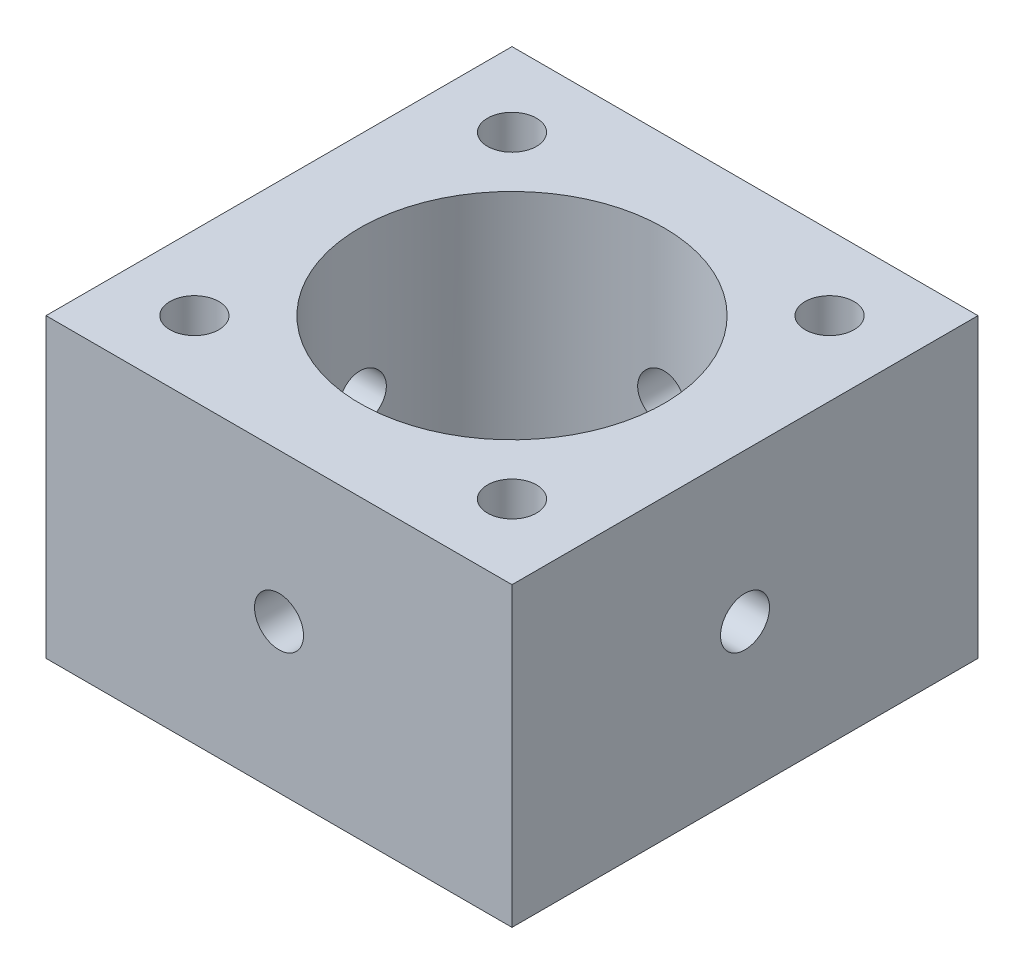
ISO-10303-21;
HEADER;
FILE_DESCRIPTION(('STEP AP214'),'2;1');
FILE_NAME('part.step','',(''),(''),'','','');
FILE_SCHEMA(('AUTOMOTIVE_DESIGN { 1 0 10303 214 1 1 1 1 }'));
ENDSEC;
DATA;
#1=APPLICATION_CONTEXT('core data for automotive mechanical design processes');
#2=APPLICATION_PROTOCOL_DEFINITION('international standard','automotive_design',2000,#1);
#3=PRODUCT_CONTEXT('',#1,'mechanical');
#4=PRODUCT('Part','Part','',(#3));
#5=PRODUCT_RELATED_PRODUCT_CATEGORY('part','',(#4));
#6=PRODUCT_DEFINITION_FORMATION('','',#4);
#7=PRODUCT_DEFINITION_CONTEXT('part definition',#1,'design');
#8=PRODUCT_DEFINITION('design','',#6,#7);
#9=PRODUCT_DEFINITION_SHAPE('','',#8);
#10=(LENGTH_UNIT() NAMED_UNIT(*) SI_UNIT(.MILLI.,.METRE.));
#11=(NAMED_UNIT(*) PLANE_ANGLE_UNIT() SI_UNIT($,.RADIAN.));
#12=(NAMED_UNIT(*) SI_UNIT($,.STERADIAN.) SOLID_ANGLE_UNIT());
#13=UNCERTAINTY_MEASURE_WITH_UNIT(LENGTH_MEASURE(1.E-05),#10,'distance_accuracy_value','');
#14=(GEOMETRIC_REPRESENTATION_CONTEXT(3) GLOBAL_UNCERTAINTY_ASSIGNED_CONTEXT((#13)) GLOBAL_UNIT_ASSIGNED_CONTEXT((#10,
#11,#12)) REPRESENTATION_CONTEXT('',''));
#15=CARTESIAN_POINT('',(0.,0.,0.));
#16=DIRECTION('',(0.,0.,1.));
#17=DIRECTION('',(1.,0.,0.));
#18=AXIS2_PLACEMENT_3D('',#15,#16,#17);
#19=CARTESIAN_POINT('',(-15.7,0.,15.7));
#20=DIRECTION('',(0.,1.,0.));
#21=DIRECTION('',(0.,0.,1.));
#22=AXIS2_PLACEMENT_3D('',#19,#20,#21);
#23=PLANE('',#22);
#24=CARTESIAN_POINT('',(-10.7,0.,10.7));
#25=DIRECTION('',(0.,-1.,0.));
#26=DIRECTION('',(0.,0.,-1.));
#27=AXIS2_PLACEMENT_3D('',#24,#25,#26);
#28=CIRCLE('',#27,1.64999999999999);
#29=CARTESIAN_POINT('',(-10.7,0.,9.05));
#30=VERTEX_POINT('',#29);
#31=EDGE_CURVE('E192',#30,#30,#28,.T.);
#32=ORIENTED_EDGE('',*,*,#31,.F.);
#33=EDGE_LOOP('',(#32));
#34=FACE_BOUND('',#33,.T.);
#35=CARTESIAN_POINT('',(10.7,0.,10.7));
#36=DIRECTION('',(0.,-1.,0.));
#37=DIRECTION('',(0.,0.,-1.));
#38=AXIS2_PLACEMENT_3D('',#35,#36,#37);
#39=CIRCLE('',#38,1.64999999999999);
#40=CARTESIAN_POINT('',(10.7,0.,9.05));
#41=VERTEX_POINT('',#40);
#42=EDGE_CURVE('E195',#41,#41,#39,.T.);
#43=ORIENTED_EDGE('',*,*,#42,.F.);
#44=EDGE_LOOP('',(#43));
#45=FACE_BOUND('',#44,.T.);
#46=CARTESIAN_POINT('',(10.7,0.,-10.7));
#47=DIRECTION('',(0.,-1.,0.));
#48=DIRECTION('',(0.,0.,-1.));
#49=AXIS2_PLACEMENT_3D('',#46,#47,#48);
#50=CIRCLE('',#49,1.64999999999999);
#51=CARTESIAN_POINT('',(10.7,0.,-12.35));
#52=VERTEX_POINT('',#51);
#53=EDGE_CURVE('E153',#52,#52,#50,.T.);
#54=ORIENTED_EDGE('',*,*,#53,.F.);
#55=EDGE_LOOP('',(#54));
#56=FACE_BOUND('',#55,.T.);
#57=CARTESIAN_POINT('',(-10.7,0.,-10.7));
#58=DIRECTION('',(0.,-1.,0.));
#59=DIRECTION('',(0.,0.,-1.));
#60=AXIS2_PLACEMENT_3D('',#57,#58,#59);
#61=CIRCLE('',#60,1.64999999999999);
#62=CARTESIAN_POINT('',(-10.7,0.,-12.35));
#63=VERTEX_POINT('',#62);
#64=EDGE_CURVE('E148',#63,#63,#61,.T.);
#65=ORIENTED_EDGE('',*,*,#64,.F.);
#66=EDGE_LOOP('',(#65));
#67=FACE_BOUND('',#66,.T.);
#68=DIRECTION('',(0.,0.,1.));
#69=VECTOR('',#68,1.);
#70=CARTESIAN_POINT('',(-15.7,0.,-15.7));
#71=LINE('',#70,#69);
#72=CARTESIAN_POINT('',(-15.7,0.,-15.7));
#73=VERTEX_POINT('',#72);
#74=CARTESIAN_POINT('',(-15.7,0.,15.7));
#75=VERTEX_POINT('',#74);
#76=EDGE_CURVE('E163',#73,#75,#71,.T.);
#77=ORIENTED_EDGE('',*,*,#76,.F.);
#78=DIRECTION('',(-1.,0.,0.));
#79=VECTOR('',#78,1.);
#80=CARTESIAN_POINT('',(-15.7,0.,-15.7));
#81=LINE('',#80,#79);
#82=CARTESIAN_POINT('',(15.7,0.,-15.7));
#83=VERTEX_POINT('',#82);
#84=EDGE_CURVE('E88',#83,#73,#81,.T.);
#85=ORIENTED_EDGE('',*,*,#84,.F.);
#86=DIRECTION('',(0.,0.,-1.));
#87=VECTOR('',#86,1.);
#88=CARTESIAN_POINT('',(15.7,0.,-15.7));
#89=LINE('',#88,#87);
#90=CARTESIAN_POINT('',(15.7,0.,15.7));
#91=VERTEX_POINT('',#90);
#92=EDGE_CURVE('E93',#91,#83,#89,.T.);
#93=ORIENTED_EDGE('',*,*,#92,.F.);
#94=DIRECTION('',(1.,0.,0.));
#95=VECTOR('',#94,1.);
#96=CARTESIAN_POINT('',(-15.7,0.,15.7));
#97=LINE('',#96,#95);
#98=EDGE_CURVE('E165',#75,#91,#97,.T.);
#99=ORIENTED_EDGE('',*,*,#98,.F.);
#100=EDGE_LOOP('',(#77,#85,#93,#99));
#101=FACE_BOUND('',#100,.T.);
#102=CARTESIAN_POINT('',(0.,0.,0.));
#103=DIRECTION('',(0.,1.,0.));
#104=DIRECTION('',(0.,0.,1.));
#105=AXIS2_PLACEMENT_3D('',#102,#103,#104);
#106=CIRCLE('',#105,10.25);
#107=CARTESIAN_POINT('',(0.,0.,10.25));
#108=VERTEX_POINT('',#107);
#109=EDGE_CURVE('E105',#108,#108,#106,.T.);
#110=ORIENTED_EDGE('',*,*,#109,.T.);
#111=EDGE_LOOP('',(#110));
#112=FACE_BOUND('',#111,.T.);
#113=ADVANCED_FACE('F34',(#34,#45,#56,#67,#101,#112),#23,.F.);
#114=CARTESIAN_POINT('',(-15.7,40.,-15.7));
#115=DIRECTION('',(1.,0.,0.));
#116=DIRECTION('',(0.,0.,-1.));
#117=AXIS2_PLACEMENT_3D('',#114,#115,#116);
#118=PLANE('',#117);
#119=CARTESIAN_POINT('',(-15.7,10.,0.));
#120=DIRECTION('',(-1.,0.,0.));
#121=DIRECTION('',(0.,0.,1.));
#122=AXIS2_PLACEMENT_3D('',#119,#120,#121);
#123=CIRCLE('',#122,1.65);
#124=CARTESIAN_POINT('',(-15.7,10.,1.65));
#125=VERTEX_POINT('',#124);
#126=EDGE_CURVE('E136',#125,#125,#123,.T.);
#127=ORIENTED_EDGE('',*,*,#126,.F.);
#128=EDGE_LOOP('',(#127));
#129=FACE_BOUND('',#128,.T.);
#130=DIRECTION('',(0.,-1.,0.));
#131=VECTOR('',#130,1.);
#132=CARTESIAN_POINT('',(-15.7,40.,15.7));
#133=LINE('',#132,#131);
#134=CARTESIAN_POINT('',(-15.7,20.,15.7));
#135=VERTEX_POINT('',#134);
#136=EDGE_CURVE('E11',#135,#75,#133,.T.);
#137=ORIENTED_EDGE('',*,*,#136,.F.);
#138=DIRECTION('',(0.,0.,1.));
#139=VECTOR('',#138,1.);
#140=CARTESIAN_POINT('',(-15.7,20.,-15.7));
#141=LINE('',#140,#139);
#142=CARTESIAN_POINT('',(-15.7,20.,-15.7));
#143=VERTEX_POINT('',#142);
#144=EDGE_CURVE('E78',#143,#135,#141,.T.);
#145=ORIENTED_EDGE('',*,*,#144,.F.);
#146=DIRECTION('',(0.,-1.,0.));
#147=VECTOR('',#146,1.);
#148=CARTESIAN_POINT('',(-15.7,40.,-15.7));
#149=LINE('',#148,#147);
#150=EDGE_CURVE('E59',#143,#73,#149,.T.);
#151=ORIENTED_EDGE('',*,*,#150,.T.);
#152=ORIENTED_EDGE('',*,*,#76,.T.);
#153=EDGE_LOOP('',(#137,#145,#151,#152));
#154=FACE_BOUND('',#153,.T.);
#155=ADVANCED_FACE('F36',(#129,#154),#118,.F.);
#156=CARTESIAN_POINT('',(-15.7,40.,15.7));
#157=DIRECTION('',(0.,0.,-1.));
#158=DIRECTION('',(-1.,0.,0.));
#159=AXIS2_PLACEMENT_3D('',#156,#157,#158);
#160=PLANE('',#159);
#161=CARTESIAN_POINT('',(0.,10.,15.7));
#162=DIRECTION('',(0.,0.,1.));
#163=DIRECTION('',(1.,0.,0.));
#164=AXIS2_PLACEMENT_3D('',#161,#162,#163);
#165=CIRCLE('',#164,1.64999999999999);
#166=CARTESIAN_POINT('',(1.64999999999999,10.,15.7));
#167=VERTEX_POINT('',#166);
#168=EDGE_CURVE('E142',#167,#167,#165,.T.);
#169=ORIENTED_EDGE('',*,*,#168,.F.);
#170=EDGE_LOOP('',(#169));
#171=FACE_BOUND('',#170,.T.);
#172=DIRECTION('',(0.,-1.,0.));
#173=VECTOR('',#172,1.);
#174=CARTESIAN_POINT('',(15.7,40.,15.7));
#175=LINE('',#174,#173);
#176=CARTESIAN_POINT('',(15.7,20.,15.7));
#177=VERTEX_POINT('',#176);
#178=EDGE_CURVE('E43',#177,#91,#175,.T.);
#179=ORIENTED_EDGE('',*,*,#178,.F.);
#180=DIRECTION('',(1.,0.,0.));
#181=VECTOR('',#180,1.);
#182=CARTESIAN_POINT('',(-15.7,20.,15.7));
#183=LINE('',#182,#181);
#184=EDGE_CURVE('E82',#135,#177,#183,.T.);
#185=ORIENTED_EDGE('',*,*,#184,.F.);
#186=ORIENTED_EDGE('',*,*,#136,.T.);
#187=ORIENTED_EDGE('',*,*,#98,.T.);
#188=EDGE_LOOP('',(#179,#185,#186,#187));
#189=FACE_BOUND('',#188,.T.);
#190=ADVANCED_FACE('F176',(#171,#189),#160,.F.);
#191=CARTESIAN_POINT('',(15.7,40.,-15.7));
#192=DIRECTION('',(-1.,0.,0.));
#193=DIRECTION('',(0.,0.,1.));
#194=AXIS2_PLACEMENT_3D('',#191,#192,#193);
#195=PLANE('',#194);
#196=CARTESIAN_POINT('',(15.7,10.,0.));
#197=DIRECTION('',(1.,0.,0.));
#198=DIRECTION('',(0.,0.,-1.));
#199=AXIS2_PLACEMENT_3D('',#196,#197,#198);
#200=CIRCLE('',#199,1.65);
#201=CARTESIAN_POINT('',(15.7,10.,-1.65));
#202=VERTEX_POINT('',#201);
#203=EDGE_CURVE('E106',#202,#202,#200,.T.);
#204=ORIENTED_EDGE('',*,*,#203,.F.);
#205=EDGE_LOOP('',(#204));
#206=FACE_BOUND('',#205,.T.);
#207=DIRECTION('',(0.,-1.,0.));
#208=VECTOR('',#207,1.);
#209=CARTESIAN_POINT('',(15.7,40.,-15.7));
#210=LINE('',#209,#208);
#211=CARTESIAN_POINT('',(15.7,20.,-15.7));
#212=VERTEX_POINT('',#211);
#213=EDGE_CURVE('E90',#212,#83,#210,.T.);
#214=ORIENTED_EDGE('',*,*,#213,.F.);
#215=DIRECTION('',(0.,0.,1.));
#216=VECTOR('',#215,1.);
#217=CARTESIAN_POINT('',(15.7,20.,-15.7));
#218=LINE('',#217,#216);
#219=EDGE_CURVE('E51',#212,#177,#218,.T.);
#220=ORIENTED_EDGE('',*,*,#219,.T.);
#221=ORIENTED_EDGE('',*,*,#178,.T.);
#222=ORIENTED_EDGE('',*,*,#92,.T.);
#223=EDGE_LOOP('',(#214,#220,#221,#222));
#224=FACE_BOUND('',#223,.T.);
#225=ADVANCED_FACE('F170',(#206,#224),#195,.F.);
#226=CARTESIAN_POINT('',(-15.7,40.,-15.7));
#227=DIRECTION('',(0.,0.,1.));
#228=DIRECTION('',(1.,0.,0.));
#229=AXIS2_PLACEMENT_3D('',#226,#227,#228);
#230=PLANE('',#229);
#231=CARTESIAN_POINT('',(0.,10.,-15.7));
#232=DIRECTION('',(0.,0.,-1.));
#233=DIRECTION('',(-1.,0.,0.));
#234=AXIS2_PLACEMENT_3D('',#231,#232,#233);
#235=CIRCLE('',#234,1.64999999999999);
#236=CARTESIAN_POINT('',(-1.64999999999999,10.,-15.7));
#237=VERTEX_POINT('',#236);
#238=EDGE_CURVE('E137',#237,#237,#235,.T.);
#239=ORIENTED_EDGE('',*,*,#238,.F.);
#240=EDGE_LOOP('',(#239));
#241=FACE_BOUND('',#240,.T.);
#242=ORIENTED_EDGE('',*,*,#150,.F.);
#243=DIRECTION('',(1.,0.,0.));
#244=VECTOR('',#243,1.);
#245=CARTESIAN_POINT('',(-15.7,20.,-15.7));
#246=LINE('',#245,#244);
#247=EDGE_CURVE('E75',#143,#212,#246,.T.);
#248=ORIENTED_EDGE('',*,*,#247,.T.);
#249=ORIENTED_EDGE('',*,*,#213,.T.);
#250=ORIENTED_EDGE('',*,*,#84,.T.);
#251=EDGE_LOOP('',(#242,#248,#249,#250));
#252=FACE_BOUND('',#251,.T.);
#253=ADVANCED_FACE('F86',(#241,#252),#230,.F.);
#254=CARTESIAN_POINT('',(0.,40.,0.));
#255=DIRECTION('',(0.,-1.,0.));
#256=DIRECTION('',(0.,0.,-1.));
#257=AXIS2_PLACEMENT_3D('',#254,#255,#256);
#258=CYLINDRICAL_SURFACE('',#257,10.25);
#259=CARTESIAN_POINT('',(0.,20.,0.));
#260=DIRECTION('',(0.,-1.,0.));
#261=DIRECTION('',(0.,0.,-1.));
#262=AXIS2_PLACEMENT_3D('',#259,#260,#261);
#263=CIRCLE('',#262,10.25);
#264=CARTESIAN_POINT('',(0.,20.,-10.25));
#265=VERTEX_POINT('',#264);
#266=EDGE_CURVE('E189',#265,#265,#263,.T.);
#267=ORIENTED_EDGE('',*,*,#266,.F.);
#268=EDGE_LOOP('',(#267));
#269=FACE_BOUND('',#268,.T.);
#270=CARTESIAN_POINT('',(1.64999999999999,10.,10.1163234428324));
#271=CARTESIAN_POINT('',(1.64999626320785,9.90796530103842,10.1163250645216));
#272=CARTESIAN_POINT('',(1.64227358488604,9.81587922357037,10.1175929948316));
#273=CARTESIAN_POINT('',(1.61159849505976,9.63428761063332,10.1225235184145));
#274=CARTESIAN_POINT('',(1.58863175284301,9.54478458614805,10.1261883649445));
#275=CARTESIAN_POINT('',(1.52817853029757,9.37101355615847,10.1354871252178));
#276=CARTESIAN_POINT('',(1.4907038341662,9.28674136616514,10.1411194405076));
#277=CARTESIAN_POINT('',(1.4023272764388,9.12569099978566,10.1537166267395));
#278=CARTESIAN_POINT('',(1.35142704453296,9.04891191537997,10.1606813359176));
#279=CARTESIAN_POINT('',(1.23714441170055,8.90431052525722,10.1752301972479));
#280=CARTESIAN_POINT('',(1.17366267489859,8.83656718279129,10.1828189780708));
#281=CARTESIAN_POINT('',(1.03623366830771,8.71264556566059,10.1977197330743));
#282=CARTESIAN_POINT('',(0.962285794774386,8.65646795863034,10.2050316912555));
#283=CARTESIAN_POINT('',(0.805513958137418,8.55697784552353,10.2186037372557));
#284=CARTESIAN_POINT('',(0.722642955441586,8.51373856339945,10.2248577542201));
#285=CARTESIAN_POINT('',(0.550696730039789,8.44182289303528,10.2355578341377));
#286=CARTESIAN_POINT('',(0.461621884337991,8.41314562074632,10.2400040068406));
#287=CARTESIAN_POINT('',(0.280611441390292,8.37140878996673,10.2465547663992));
#288=CARTESIAN_POINT('',(0.188707132589422,8.35821670284183,10.2486792125649));
#289=CARTESIAN_POINT('',(0.00396657825405458,8.34741281992212,10.2504153245496));
#290=CARTESIAN_POINT('',(-0.0888696076287432,8.34980003312929,10.2500271501963));
#291=CARTESIAN_POINT('',(-0.27193319074332,8.36998319787412,10.2467975303243));
#292=CARTESIAN_POINT('',(-0.362176768745165,8.387636539547,10.2439787908391));
#293=CARTESIAN_POINT('',(-0.53840386169636,8.43762653778995,10.2362300589107));
#294=CARTESIAN_POINT('',(-0.624387253739316,8.46996361771272,10.2313000055956));
#295=CARTESIAN_POINT('',(-0.790079991565614,8.54854639047806,10.2198437913575));
#296=CARTESIAN_POINT('',(-0.869760767999887,8.59485129461488,10.2133108580808));
#297=CARTESIAN_POINT('',(-1.02027500095091,8.70001196350102,10.1993755108456));
#298=CARTESIAN_POINT('',(-1.09110778778897,8.75886867734884,10.1919730311557));
#299=CARTESIAN_POINT('',(-1.22275726407711,8.88825444849753,10.1770237355564));
#300=CARTESIAN_POINT('',(-1.28345148425938,8.95890810390631,10.1694762343532));
#301=CARTESIAN_POINT('',(-1.3921423764453,9.10946111031713,10.1551688424713));
#302=CARTESIAN_POINT('',(-1.44013894603403,9.18936053588493,10.1484089581453));
#303=CARTESIAN_POINT('',(-1.52209349756418,9.35627398159614,10.1364420141689));
#304=CARTESIAN_POINT('',(-1.55603749669842,9.44329498536655,10.1312365026029));
#305=CARTESIAN_POINT('',(-1.60879275531895,9.62190585107881,10.1229939071746));
#306=CARTESIAN_POINT('',(-1.62760525258765,9.71349533865989,10.1199566459481));
#307=CARTESIAN_POINT('',(-1.64939262528064,9.89754967936762,10.1164285273994));
#308=CARTESIAN_POINT('',(-1.65254173812167,9.98999338804182,10.1159096574037));
#309=CARTESIAN_POINT('',(-1.64337656584264,10.1740874872316,10.1174025419157));
#310=CARTESIAN_POINT('',(-1.63106283627603,10.2657379061296,10.1194142055055));
#311=CARTESIAN_POINT('',(-1.59146980412387,10.4450951677704,10.1257156647007));
#312=CARTESIAN_POINT('',(-1.5642785251192,10.5328219541062,10.1299920562288));
#313=CARTESIAN_POINT('',(-1.49579430593821,10.7024732611199,10.1403299510429));
#314=CARTESIAN_POINT('',(-1.4545005734708,10.7843974554896,10.1463915546214));
#315=CARTESIAN_POINT('',(-1.35856979325503,10.9408954863295,10.1596822937066));
#316=CARTESIAN_POINT('',(-1.3038206893937,11.0153998025092,10.1669210517745));
#317=CARTESIAN_POINT('',(-1.18268778744385,11.1542258782826,10.1817220380689));
#318=CARTESIAN_POINT('',(-1.11630322796089,11.2185469709878,10.1892842874393));
#319=CARTESIAN_POINT('',(-0.973013498737683,11.3358132989623,10.2039684178277));
#320=CARTESIAN_POINT('',(-0.896012858138165,11.3886425914571,10.2110853368955));
#321=CARTESIAN_POINT('',(-0.734128323515491,11.4806151048699,10.2239982139765));
#322=CARTESIAN_POINT('',(-0.649244671127437,11.519758745114,10.2297942124607));
#323=CARTESIAN_POINT('',(-0.474354260588597,11.5830666762693,10.2393905692708));
#324=CARTESIAN_POINT('',(-0.38437028049739,11.6072925962704,10.2431991281467));
#325=CARTESIAN_POINT('',(-0.201545067913638,11.6402762181998,10.2484260686483));
#326=CARTESIAN_POINT('',(-0.108704054640067,11.6490351039112,10.2498446331941));
#327=CARTESIAN_POINT('',(0.0760788423922117,11.6508037826902,10.2501294315424));
#328=CARTESIAN_POINT('',(0.168019038436588,11.6439903313716,10.2490243108448));
#329=CARTESIAN_POINT('',(0.349427682934003,11.6151888429829,10.2444441337809));
#330=CARTESIAN_POINT('',(0.438896143018976,11.5932008773364,10.2409690885693));
#331=CARTESIAN_POINT('',(0.612760794437752,11.5347405690476,10.2320379616861));
#332=CARTESIAN_POINT('',(0.697161815188908,11.4982822776568,10.2265838022511));
#333=CARTESIAN_POINT('',(0.858676186407721,11.4119356029987,10.2142911329505));
#334=CARTESIAN_POINT('',(0.93578922905388,11.3620466528042,10.2074525646501));
#335=CARTESIAN_POINT('',(1.08143130693129,11.24962374617,10.1930577745197));
#336=CARTESIAN_POINT('',(1.14985945334196,11.1869599610115,10.1854946449556));
#337=CARTESIAN_POINT('',(1.27529218265869,11.0510390431265,10.1705521114207));
#338=CARTESIAN_POINT('',(1.3322940854736,10.977779432009,10.1631727509086));
#339=CARTESIAN_POINT('',(1.43359677021403,10.8221783925016,10.1493811996165));
#340=CARTESIAN_POINT('',(1.47781192042539,10.7397806249446,10.1429756599047));
#341=CARTESIAN_POINT('',(1.5517067232382,10.5686599793084,10.1319353591568));
#342=CARTESIAN_POINT('',(1.58140109653129,10.4799436118185,10.1272988058326));
#343=CARTESIAN_POINT('',(1.61885958109835,10.3257187870883,10.1213649528678));
#344=CARTESIAN_POINT('',(1.63051881227416,10.2611510375106,10.1194847248139));
#345=CARTESIAN_POINT('',(1.64609028958744,10.131064201361,10.11696340237));
#346=CARTESIAN_POINT('',(1.65000266126287,10.0655451302224,10.1163222879002));
#347=CARTESIAN_POINT('',(1.64999999999999,10.,10.1163234428324));
#348=B_SPLINE_CURVE_WITH_KNOTS('',3,(#270,#271,#272,#273,#274,#275,#276,#277,#278,#279,#280,
#281,#282,#283,#284,#285,#286,#287,#288,#289,#290,#291,#292,#293,#294,#295,#296,#297,#298,#299,
#300,#301,#302,#303,#304,#305,#306,#307,#308,#309,#310,#311,#312,#313,#314,#315,#316,#317,#318,
#319,#320,#321,#322,#323,#324,#325,#326,#327,#328,#329,#330,#331,#332,#333,#334,#335,#336,#337,
#338,#339,#340,#341,#342,#343,#344,#345,#346,#347),.UNSPECIFIED.,.T.,.F.,(4,2,2,2,2,2,2,2,2,2,2,
2,2,2,2,2,2,2,2,2,2,2,2,2,2,2,2,2,2,2,2,2,2,2,2,2,2,2,4),(0.,0.275864450470172,
0.551988604911591,0.827888944365752,1.10375580840995,1.38189436557628,1.66004897385049,
1.93974924208297,2.21943252788788,2.49670430039844,2.77395843584608,3.04865021723869,
3.32334991888207,3.59923087300145,3.87513269511535,4.15415797189366,4.43318549912625,
4.71249000519644,4.99177166136193,5.26793956707235,5.54409755082674,5.81863903124487,
6.09319593823815,6.37012180901308,6.64706580787803,6.92668617939728,7.20629798264192,
7.48474674578487,7.7631741966812,8.03845704146742,8.31373859055804,8.58875348194181,
8.86377998391178,9.14175494604531,9.41979503270758,9.69965615474593,9.97923297145011,
10.1757008748941,10.3721655945468),.UNSPECIFIED.);
#349=CARTESIAN_POINT('',(1.64999999999999,10.,10.1163234428324));
#350=VERTEX_POINT('',#349);
#351=EDGE_CURVE('E138',#350,#350,#348,.T.);
#352=ORIENTED_EDGE('',*,*,#351,.F.);
#353=EDGE_LOOP('',(#352));
#354=FACE_BOUND('',#353,.T.);
#355=CARTESIAN_POINT('',(0.,11.65,-10.25));
#356=CARTESIAN_POINT('',(-0.0920434089047747,11.6499962705392,-10.2499984550547));
#357=CARTESIAN_POINT('',(-0.184138173987588,11.6422721797927,-10.2487472545962));
#358=CARTESIAN_POINT('',(-0.365747832202078,11.6115909708202,-10.2438764285908));
#359=CARTESIAN_POINT('',(-0.455260221295045,11.5886195537286,-10.2402545799062));
#360=CARTESIAN_POINT('',(-0.629051069287774,11.5281526603095,-10.2310489698499));
#361=CARTESIAN_POINT('',(-0.713333633389691,11.4906687474204,-10.2254667707977));
#362=CARTESIAN_POINT('',(-0.874401440858712,11.4022704730974,-10.2129553143814));
#363=CARTESIAN_POINT('',(-0.951187604635479,11.3513577633028,-10.2060262227023));
#364=CARTESIAN_POINT('',(-1.09578124314283,11.2370624242279,-10.1915206642345));
#365=CARTESIAN_POINT('',(-1.16351194022381,11.1735832553856,-10.1839394601291));
#366=CARTESIAN_POINT('',(-1.28740908218554,11.0361647261701,-10.169020672235));
#367=CARTESIAN_POINT('',(-1.34357482058121,10.9622247272264,-10.1616831033526));
#368=CARTESIAN_POINT('',(-1.44305232821111,10.8054600302228,-10.1480364742931));
#369=CARTESIAN_POINT('',(-1.48628874658498,10.7225869377301,-10.1417335363118));
#370=CARTESIAN_POINT('',(-1.55819854928863,10.550636179183,-10.1309351857962));
#371=CARTESIAN_POINT('',(-1.58687284975091,10.4615589038474,-10.1264396595576));
#372=CARTESIAN_POINT('',(-1.62860375637728,10.2805400384175,-10.1198120960087));
#373=CARTESIAN_POINT('',(-1.64179253507408,10.1886296640954,-10.1176600680375));
#374=CARTESIAN_POINT('',(-1.65258769837535,10.0038771607245,-10.1159026162817));
#375=CARTESIAN_POINT('',(-1.65019511199859,9.91103509361051,-10.1162970243261));
#376=CARTESIAN_POINT('',(-1.63000324535624,9.72799468264556,-10.119569619299));
#377=CARTESIAN_POINT('',(-1.61235199209537,9.63777952082778,-10.1224239413624));
#378=CARTESIAN_POINT('',(-1.56237594518673,9.4616081739625,-10.1302574252621));
#379=CARTESIAN_POINT('',(-1.53005067920933,9.37565212610688,-10.135236655495));
#380=CARTESIAN_POINT('',(-1.45149275961021,9.20999328735992,-10.146784907503));
#381=CARTESIAN_POINT('',(-1.40519820373422,9.13032036310956,-10.1533609795147));
#382=CARTESIAN_POINT('',(-1.30005983384883,8.97981748575513,-10.1673569938845));
#383=CARTESIAN_POINT('',(-1.24121507358326,8.90898820007958,-10.1747769998535));
#384=CARTESIAN_POINT('',(-1.11183803238065,8.77732595580664,-10.1897299033563));
#385=CARTESIAN_POINT('',(-1.04117865222959,8.71661785672658,-10.1972631151758));
#386=CARTESIAN_POINT('',(-0.890609160268702,8.60790165418653,-10.2115143065729));
#387=CARTESIAN_POINT('',(-0.810698996041511,8.5598936226935,-10.2182322815307));
#388=CARTESIAN_POINT('',(-0.643782131840819,8.47793071538147,-10.2301046836072));
#389=CARTESIAN_POINT('',(-0.556770169252844,8.44398637639352,-10.235257937633));
#390=CARTESIAN_POINT('',(-0.378179029636076,8.39122769155013,-10.2434107202163));
#391=CARTESIAN_POINT('',(-0.28660020932858,8.37241216592951,-10.2464104167093));
#392=CARTESIAN_POINT('',(-0.102551623970413,8.35061333212523,-10.2498956383117));
#393=CARTESIAN_POINT('',(-0.0101026680905594,8.34745852996372,-10.250408395412));
#394=CARTESIAN_POINT('',(0.174003272279996,8.35661419656928,-10.2489363890435));
#395=CARTESIAN_POINT('',(0.265660285013159,8.36892411151883,-10.2469517150119));
#396=CARTESIAN_POINT('',(0.445054437635825,8.40851714764433,-10.2407246972319));
#397=CARTESIAN_POINT('',(0.532810690943011,8.43571584215069,-10.2364950874416));
#398=CARTESIAN_POINT('',(0.702517669604904,8.50422470716035,-10.226250667807));
#399=CARTESIAN_POINT('',(0.784468087076381,8.54553562535897,-10.2202357633762));
#400=CARTESIAN_POINT('',(0.940985283438293,8.64149241558861,-10.2070208125669));
#401=CARTESIAN_POINT('',(1.01548521732285,8.6962459991995,-10.1998113543988));
#402=CARTESIAN_POINT('',(1.1543003793635,8.8173850690934,-10.185036706576));
#403=CARTESIAN_POINT('',(1.21861491976675,8.88377134021854,-10.1774714929444));
#404=CARTESIAN_POINT('',(1.33586522456138,9.02705849898969,-10.1627505238836));
#405=CARTESIAN_POINT('',(1.38868543496489,9.10405449475177,-10.1555994136414));
#406=CARTESIAN_POINT('',(1.48064203400305,9.26592713851785,-10.1426014890035));
#407=CARTESIAN_POINT('',(1.51977883473296,9.35080354909455,-10.1367546353302));
#408=CARTESIAN_POINT('',(1.58308261767426,9.52569703026347,-10.1270616579201));
#409=CARTESIAN_POINT('',(1.6073082762023,9.6156924090522,-10.1232077017059));
#410=CARTESIAN_POINT('',(1.64028751963766,9.79854181259628,-10.1179168117108));
#411=CARTESIAN_POINT('',(1.64904235100485,9.89139560644036,-10.1164796832103));
#412=CARTESIAN_POINT('',(1.6507984552767,10.0761729562924,-10.1161931673507));
#413=CARTESIAN_POINT('',(1.64398154031451,10.1680947890376,-10.1173139146879));
#414=CARTESIAN_POINT('',(1.61517955333425,10.3494658022457,-10.1219516100928));
#415=CARTESIAN_POINT('',(1.59319452122765,10.4389149892143,-10.1254685518555));
#416=CARTESIAN_POINT('',(1.53474815919674,10.6127382780731,-10.1344913346517));
#417=CARTESIAN_POINT('',(1.49830144833415,10.6971174063187,-10.1399951666669));
#418=CARTESIAN_POINT('',(1.4119847649759,10.8585927712922,-10.1523736986766));
#419=CARTESIAN_POINT('',(1.36211420048433,10.9356886866255,-10.159248459126));
#420=CARTESIAN_POINT('',(1.24971242639421,11.0813295824335,-10.1736893970378));
#421=CARTESIAN_POINT('',(1.18704712988293,11.1497704164432,-10.1812623881173));
#422=CARTESIAN_POINT('',(1.05111784924269,11.2752280425897,-10.1961912683571));
#423=CARTESIAN_POINT('',(0.97785141721323,11.3322421889262,-10.2035471069012));
#424=CARTESIAN_POINT('',(0.822243954199361,11.4335591474374,-10.2172671969858));
#425=CARTESIAN_POINT('',(0.739847837018833,11.4777782556582,-10.2236247997724));
#426=CARTESIAN_POINT('',(0.568730482655452,11.5516809053593,-10.2345672719525));
#427=CARTESIAN_POINT('',(0.480015738414033,11.5813791283123,-10.2391539308834));
#428=CARTESIAN_POINT('',(0.325780810171292,11.6188476469155,-10.2450204758939));
#429=CARTESIAN_POINT('',(0.261200646228259,11.6305113749522,-10.2468779552584));
#430=CARTESIAN_POINT('',(0.131088995955238,11.6460888198596,-10.2493682580552));
#431=CARTESIAN_POINT('',(0.0655575243173356,11.6500026562925,-10.2500011003807));
#432=CARTESIAN_POINT('',(0.,11.65,-10.25));
#433=B_SPLINE_CURVE_WITH_KNOTS('',3,(#355,#356,#357,#358,#359,#360,#361,#362,#363,#364,#365,
#366,#367,#368,#369,#370,#371,#372,#373,#374,#375,#376,#377,#378,#379,#380,#381,#382,#383,#384,
#385,#386,#387,#388,#389,#390,#391,#392,#393,#394,#395,#396,#397,#398,#399,#400,#401,#402,#403,
#404,#405,#406,#407,#408,#409,#410,#411,#412,#413,#414,#415,#416,#417,#418,#419,#420,#421,#422,
#423,#424,#425,#426,#427,#428,#429,#430,#431,#432),.UNSPECIFIED.,.T.,.F.,(4,2,2,2,2,2,2,2,2,2,2,
2,2,2,2,2,2,2,2,2,2,2,2,2,2,2,2,2,2,2,2,2,2,2,2,2,2,2,4),(0.,0.275890622648551,
0.552040340372122,0.827970475587745,1.10386668932106,1.3819709869499,1.66009226849476,
1.93980416686507,2.21949846580924,2.49678774305517,2.7740587078507,3.04866962547421,
3.32328938294764,3.59914439682041,3.87502021687598,4.15408129119476,4.43314394682372,
4.71241530595303,4.99166488501399,5.26784966855393,5.54402456173441,5.81864939069694,
6.09328877211831,6.37020499799409,6.64713991424198,6.92674197807529,7.20633562057127,
7.48482188985734,7.76328572092573,8.03851491433824,8.31374338355038,8.58869433498536,
8.86365741382573,9.14166540357105,9.41973769068902,9.69958997385185,9.97915872171167,
10.1756636693119,10.3721655852928),.UNSPECIFIED.);
#434=CARTESIAN_POINT('',(0.,11.65,-10.25));
#435=VERTEX_POINT('',#434);
#436=EDGE_CURVE('E132',#435,#435,#433,.T.);
#437=ORIENTED_EDGE('',*,*,#436,.F.);
#438=EDGE_LOOP('',(#437));
#439=FACE_BOUND('',#438,.T.);
#440=CARTESIAN_POINT('',(-10.1163234428324,10.,1.65));
#441=CARTESIAN_POINT('',(-10.1163250645216,9.90796530103842,1.64999626320785));
#442=CARTESIAN_POINT('',(-10.1175929948316,9.81587922357037,1.64227358488604));
#443=CARTESIAN_POINT('',(-10.1225235184145,9.63428761063332,1.61159849505977));
#444=CARTESIAN_POINT('',(-10.1261883649445,9.54478458614805,1.58863175284301));
#445=CARTESIAN_POINT('',(-10.1354871252178,9.37101355615846,1.52817853029757));
#446=CARTESIAN_POINT('',(-10.1411194405076,9.28674136616514,1.4907038341662));
#447=CARTESIAN_POINT('',(-10.1537166267395,9.12569099978566,1.4023272764388));
#448=CARTESIAN_POINT('',(-10.1606813359176,9.04891191537997,1.35142704453296));
#449=CARTESIAN_POINT('',(-10.1752301972479,8.90431052525722,1.23714441170055));
#450=CARTESIAN_POINT('',(-10.1828189780708,8.83656718279128,1.17366267489859));
#451=CARTESIAN_POINT('',(-10.1977197330743,8.71264556566058,1.03623366830771));
#452=CARTESIAN_POINT('',(-10.2050316912555,8.65646795863033,0.962285794774388));
#453=CARTESIAN_POINT('',(-10.2186037372557,8.55697784552353,0.80551395813742));
#454=CARTESIAN_POINT('',(-10.2248577542201,8.51373856339944,0.722642955441589));
#455=CARTESIAN_POINT('',(-10.2355578341377,8.44182289303527,0.550696730039791));
#456=CARTESIAN_POINT('',(-10.2400040068406,8.41314562074632,0.461621884337992));
#457=CARTESIAN_POINT('',(-10.2465547663992,8.37140878996672,0.280611441390293));
#458=CARTESIAN_POINT('',(-10.2486792125649,8.35821670284182,0.188707132589423));
#459=CARTESIAN_POINT('',(-10.2504153245496,8.34741281992211,0.00396657825405451));
#460=CARTESIAN_POINT('',(-10.2500271501963,8.34980003312928,-0.0888696076287436));
#461=CARTESIAN_POINT('',(-10.2467975303243,8.36998319787411,-0.271933190743321));
#462=CARTESIAN_POINT('',(-10.2439787908391,8.38763653954699,-0.362176768745166));
#463=CARTESIAN_POINT('',(-10.2362300589107,8.43762653778995,-0.538403861696361));
#464=CARTESIAN_POINT('',(-10.2313000055956,8.46996361771272,-0.624387253739318));
#465=CARTESIAN_POINT('',(-10.2198437913575,8.54854639047805,-0.790079991565617));
#466=CARTESIAN_POINT('',(-10.2133108580808,8.59485129461487,-0.86976076799989));
#467=CARTESIAN_POINT('',(-10.1993755108456,8.70001196350102,-1.02027500095092));
#468=CARTESIAN_POINT('',(-10.1919730311557,8.75886867734884,-1.09110778778897));
#469=CARTESIAN_POINT('',(-10.1770237355564,8.88825444849753,-1.22275726407711));
#470=CARTESIAN_POINT('',(-10.1694762343532,8.95890810390631,-1.28345148425938));
#471=CARTESIAN_POINT('',(-10.1551688424713,9.10946111031713,-1.39214237644531));
#472=CARTESIAN_POINT('',(-10.1484089581453,9.18936053588492,-1.44013894603403));
#473=CARTESIAN_POINT('',(-10.1364420141689,9.35627398159614,-1.52209349756419));
#474=CARTESIAN_POINT('',(-10.1312365026029,9.44329498536655,-1.55603749669843));
#475=CARTESIAN_POINT('',(-10.1229939071746,9.62190585107881,-1.60879275531895));
#476=CARTESIAN_POINT('',(-10.1199566459481,9.71349533865989,-1.62760525258765));
#477=CARTESIAN_POINT('',(-10.1164285273994,9.89754967936762,-1.64939262528065));
#478=CARTESIAN_POINT('',(-10.1159096574037,9.98999338804182,-1.65254173812168));
#479=CARTESIAN_POINT('',(-10.1174025419157,10.1740874872316,-1.64337656584265));
#480=CARTESIAN_POINT('',(-10.1194142055055,10.2657379061296,-1.63106283627604));
#481=CARTESIAN_POINT('',(-10.1257156647007,10.4450951677704,-1.59146980412387));
#482=CARTESIAN_POINT('',(-10.1299920562288,10.5328219541062,-1.56427852511921));
#483=CARTESIAN_POINT('',(-10.1403299510429,10.7024732611199,-1.49579430593821));
#484=CARTESIAN_POINT('',(-10.1463915546214,10.7843974554896,-1.4545005734708));
#485=CARTESIAN_POINT('',(-10.1596822937066,10.9408954863295,-1.35856979325503));
#486=CARTESIAN_POINT('',(-10.1669210517745,11.0153998025092,-1.30382068939371));
#487=CARTESIAN_POINT('',(-10.1817220380689,11.1542258782826,-1.18268778744385));
#488=CARTESIAN_POINT('',(-10.1892842874393,11.2185469709878,-1.11630322796089));
#489=CARTESIAN_POINT('',(-10.2039684178277,11.3358132989623,-0.973013498737687));
#490=CARTESIAN_POINT('',(-10.2110853368955,11.3886425914571,-0.896012858138168));
#491=CARTESIAN_POINT('',(-10.2239982139765,11.4806151048699,-0.734128323515495));
#492=CARTESIAN_POINT('',(-10.2297942124607,11.519758745114,-0.649244671127441));
#493=CARTESIAN_POINT('',(-10.2393905692708,11.5830666762693,-0.4743542605886));
#494=CARTESIAN_POINT('',(-10.2431991281467,11.6072925962705,-0.384370280497393));
#495=CARTESIAN_POINT('',(-10.2484260686483,11.6402762181998,-0.201545067913641));
#496=CARTESIAN_POINT('',(-10.2498446331941,11.6490351039112,-0.108704054640068));
#497=CARTESIAN_POINT('',(-10.2501294315424,11.6508037826902,0.0760788423922109));
#498=CARTESIAN_POINT('',(-10.2490243108448,11.6439903313716,0.168019038436587));
#499=CARTESIAN_POINT('',(-10.2444441337809,11.6151888429829,0.349427682934003));
#500=CARTESIAN_POINT('',(-10.2409690885693,11.5932008773364,0.438896143018976));
#501=CARTESIAN_POINT('',(-10.2320379616861,11.5347405690476,0.612760794437752));
#502=CARTESIAN_POINT('',(-10.2265838022511,11.4982822776568,0.69716181518891));
#503=CARTESIAN_POINT('',(-10.2142911329505,11.4119356029987,0.858676186407722));
#504=CARTESIAN_POINT('',(-10.2074525646501,11.3620466528042,0.935789229053882));
#505=CARTESIAN_POINT('',(-10.1930577745197,11.24962374617,1.08143130693129));
#506=CARTESIAN_POINT('',(-10.1854946449556,11.1869599610115,1.14985945334196));
#507=CARTESIAN_POINT('',(-10.1705521114207,11.0510390431265,1.27529218265869));
#508=CARTESIAN_POINT('',(-10.1631727509086,10.977779432009,1.33229408547361));
#509=CARTESIAN_POINT('',(-10.1493811996165,10.8221783925016,1.43359677021403));
#510=CARTESIAN_POINT('',(-10.1429756599047,10.7397806249446,1.47781192042539));
#511=CARTESIAN_POINT('',(-10.1319353591568,10.5686599793084,1.5517067232382));
#512=CARTESIAN_POINT('',(-10.1272988058326,10.4799436118185,1.58140109653129));
#513=CARTESIAN_POINT('',(-10.1213649528678,10.3257187870883,1.61885958109835));
#514=CARTESIAN_POINT('',(-10.1194847248139,10.2611510375106,1.63051881227417));
#515=CARTESIAN_POINT('',(-10.11696340237,10.131064201361,1.64609028958744));
#516=CARTESIAN_POINT('',(-10.1163222879002,10.0655451302224,1.65000266126288));
#517=CARTESIAN_POINT('',(-10.1163234428324,10.,1.65));
#518=B_SPLINE_CURVE_WITH_KNOTS('',3,(#440,#441,#442,#443,#444,#445,#446,#447,#448,#449,#450,
#451,#452,#453,#454,#455,#456,#457,#458,#459,#460,#461,#462,#463,#464,#465,#466,#467,#468,#469,
#470,#471,#472,#473,#474,#475,#476,#477,#478,#479,#480,#481,#482,#483,#484,#485,#486,#487,#488,
#489,#490,#491,#492,#493,#494,#495,#496,#497,#498,#499,#500,#501,#502,#503,#504,#505,#506,#507,
#508,#509,#510,#511,#512,#513,#514,#515,#516,#517),.UNSPECIFIED.,.T.,.F.,(4,2,2,2,2,2,2,2,2,2,2,
2,2,2,2,2,2,2,2,2,2,2,2,2,2,2,2,2,2,2,2,2,2,2,2,2,2,2,4),(0.,0.275864450470173,
0.551988604911592,0.827888944365755,1.10375580840996,1.38189436557629,1.6600489738505,
1.93974924208297,2.21943252788788,2.49670430039845,2.77395843584609,3.0486502172387,
3.32334991888208,3.59923087300146,3.87513269511536,4.15415797189367,4.43318549912627,
4.71249000519646,4.99177166136195,5.26793956707236,5.54409755082675,5.81863903124488,
6.09319593823817,6.3701218090131,6.64706580787804,6.9266861793973,7.20629798264194,
7.48474674578489,7.76317419668122,8.03845704146744,8.31373859055806,8.58875348194184,
8.8637799839118,9.14175494604534,9.41979503270761,9.69965615474596,9.97923297145013,
10.1757008748941,10.3721655945469),.UNSPECIFIED.);
#519=CARTESIAN_POINT('',(-10.1163234428324,10.,1.65));
#520=VERTEX_POINT('',#519);
#521=EDGE_CURVE('E107',#520,#520,#518,.T.);
#522=ORIENTED_EDGE('',*,*,#521,.F.);
#523=EDGE_LOOP('',(#522));
#524=FACE_BOUND('',#523,.T.);
#525=CARTESIAN_POINT('',(10.1163234428324,10.,-1.65));
#526=CARTESIAN_POINT('',(10.1163250645216,9.90796530103842,-1.64999626320785));
#527=CARTESIAN_POINT('',(10.1175929948316,9.81587922357037,-1.64227358488604));
#528=CARTESIAN_POINT('',(10.1225235184145,9.63428761063332,-1.61159849505977));
#529=CARTESIAN_POINT('',(10.1261883649445,9.54478458614805,-1.58863175284301));
#530=CARTESIAN_POINT('',(10.1354871252178,9.37101355615846,-1.52817853029757));
#531=CARTESIAN_POINT('',(10.1411194405076,9.28674136616514,-1.4907038341662));
#532=CARTESIAN_POINT('',(10.1537166267395,9.12569099978566,-1.4023272764388));
#533=CARTESIAN_POINT('',(10.1606813359176,9.04891191537997,-1.35142704453296));
#534=CARTESIAN_POINT('',(10.1752301972479,8.90431052525722,-1.23714441170055));
#535=CARTESIAN_POINT('',(10.1828189780708,8.83656718279128,-1.17366267489859));
#536=CARTESIAN_POINT('',(10.1977197330743,8.71264556566058,-1.03623366830771));
#537=CARTESIAN_POINT('',(10.2050316912555,8.65646795863033,-0.962285794774388));
#538=CARTESIAN_POINT('',(10.2186037372557,8.55697784552353,-0.80551395813742));
#539=CARTESIAN_POINT('',(10.2248577542201,8.51373856339944,-0.722642955441589));
#540=CARTESIAN_POINT('',(10.2355578341377,8.44182289303527,-0.550696730039791));
#541=CARTESIAN_POINT('',(10.2400040068406,8.41314562074632,-0.461621884337992));
#542=CARTESIAN_POINT('',(10.2465547663992,8.37140878996672,-0.280611441390293));
#543=CARTESIAN_POINT('',(10.2486792125649,8.35821670284182,-0.188707132589423));
#544=CARTESIAN_POINT('',(10.2504153245496,8.34741281992211,-0.00396657825405451));
#545=CARTESIAN_POINT('',(10.2500271501963,8.34980003312928,0.0888696076287436));
#546=CARTESIAN_POINT('',(10.2467975303243,8.36998319787411,0.271933190743321));
#547=CARTESIAN_POINT('',(10.2439787908391,8.38763653954699,0.362176768745166));
#548=CARTESIAN_POINT('',(10.2362300589107,8.43762653778995,0.538403861696361));
#549=CARTESIAN_POINT('',(10.2313000055956,8.46996361771272,0.624387253739318));
#550=CARTESIAN_POINT('',(10.2198437913575,8.54854639047805,0.790079991565617));
#551=CARTESIAN_POINT('',(10.2133108580808,8.59485129461487,0.86976076799989));
#552=CARTESIAN_POINT('',(10.1993755108456,8.70001196350102,1.02027500095092));
#553=CARTESIAN_POINT('',(10.1919730311557,8.75886867734884,1.09110778778897));
#554=CARTESIAN_POINT('',(10.1770237355564,8.88825444849753,1.22275726407711));
#555=CARTESIAN_POINT('',(10.1694762343532,8.95890810390631,1.28345148425938));
#556=CARTESIAN_POINT('',(10.1551688424713,9.10946111031713,1.39214237644531));
#557=CARTESIAN_POINT('',(10.1484089581453,9.18936053588492,1.44013894603403));
#558=CARTESIAN_POINT('',(10.1364420141689,9.35627398159614,1.52209349756419));
#559=CARTESIAN_POINT('',(10.1312365026029,9.44329498536655,1.55603749669843));
#560=CARTESIAN_POINT('',(10.1229939071746,9.62190585107881,1.60879275531895));
#561=CARTESIAN_POINT('',(10.1199566459481,9.71349533865989,1.62760525258765));
#562=CARTESIAN_POINT('',(10.1164285273994,9.89754967936762,1.64939262528065));
#563=CARTESIAN_POINT('',(10.1159096574037,9.98999338804182,1.65254173812168));
#564=CARTESIAN_POINT('',(10.1174025419157,10.1740874872316,1.64337656584265));
#565=CARTESIAN_POINT('',(10.1194142055055,10.2657379061296,1.63106283627604));
#566=CARTESIAN_POINT('',(10.1257156647007,10.4450951677704,1.59146980412387));
#567=CARTESIAN_POINT('',(10.1299920562288,10.5328219541062,1.56427852511921));
#568=CARTESIAN_POINT('',(10.1403299510429,10.7024732611199,1.49579430593821));
#569=CARTESIAN_POINT('',(10.1463915546214,10.7843974554896,1.4545005734708));
#570=CARTESIAN_POINT('',(10.1596822937066,10.9408954863295,1.35856979325503));
#571=CARTESIAN_POINT('',(10.1669210517745,11.0153998025092,1.30382068939371));
#572=CARTESIAN_POINT('',(10.1817220380689,11.1542258782826,1.18268778744385));
#573=CARTESIAN_POINT('',(10.1892842874393,11.2185469709878,1.11630322796089));
#574=CARTESIAN_POINT('',(10.2039684178277,11.3358132989623,0.973013498737687));
#575=CARTESIAN_POINT('',(10.2110853368955,11.3886425914571,0.896012858138168));
#576=CARTESIAN_POINT('',(10.2239982139765,11.4806151048699,0.734128323515495));
#577=CARTESIAN_POINT('',(10.2297942124607,11.519758745114,0.649244671127441));
#578=CARTESIAN_POINT('',(10.2393905692708,11.5830666762693,0.4743542605886));
#579=CARTESIAN_POINT('',(10.2431991281467,11.6072925962705,0.384370280497393));
#580=CARTESIAN_POINT('',(10.2484260686483,11.6402762181998,0.201545067913641));
#581=CARTESIAN_POINT('',(10.2498446331941,11.6490351039112,0.108704054640068));
#582=CARTESIAN_POINT('',(10.2501294315424,11.6508037826902,-0.0760788423922109));
#583=CARTESIAN_POINT('',(10.2490243108448,11.6439903313716,-0.168019038436587));
#584=CARTESIAN_POINT('',(10.2444441337809,11.6151888429829,-0.349427682934003));
#585=CARTESIAN_POINT('',(10.2409690885693,11.5932008773364,-0.438896143018976));
#586=CARTESIAN_POINT('',(10.2320379616861,11.5347405690476,-0.612760794437752));
#587=CARTESIAN_POINT('',(10.2265838022511,11.4982822776568,-0.69716181518891));
#588=CARTESIAN_POINT('',(10.2142911329505,11.4119356029987,-0.858676186407722));
#589=CARTESIAN_POINT('',(10.2074525646501,11.3620466528042,-0.935789229053882));
#590=CARTESIAN_POINT('',(10.1930577745197,11.24962374617,-1.08143130693129));
#591=CARTESIAN_POINT('',(10.1854946449556,11.1869599610115,-1.14985945334196));
#592=CARTESIAN_POINT('',(10.1705521114207,11.0510390431265,-1.27529218265869));
#593=CARTESIAN_POINT('',(10.1631727509086,10.977779432009,-1.33229408547361));
#594=CARTESIAN_POINT('',(10.1493811996165,10.8221783925016,-1.43359677021403));
#595=CARTESIAN_POINT('',(10.1429756599047,10.7397806249446,-1.47781192042539));
#596=CARTESIAN_POINT('',(10.1319353591568,10.5686599793084,-1.5517067232382));
#597=CARTESIAN_POINT('',(10.1272988058326,10.4799436118185,-1.58140109653129));
#598=CARTESIAN_POINT('',(10.1213649528678,10.3257187870883,-1.61885958109835));
#599=CARTESIAN_POINT('',(10.1194847248139,10.2611510375106,-1.63051881227417));
#600=CARTESIAN_POINT('',(10.11696340237,10.131064201361,-1.64609028958744));
#601=CARTESIAN_POINT('',(10.1163222879002,10.0655451302224,-1.65000266126288));
#602=CARTESIAN_POINT('',(10.1163234428324,10.,-1.65));
#603=B_SPLINE_CURVE_WITH_KNOTS('',3,(#525,#526,#527,#528,#529,#530,#531,#532,#533,#534,#535,
#536,#537,#538,#539,#540,#541,#542,#543,#544,#545,#546,#547,#548,#549,#550,#551,#552,#553,#554,
#555,#556,#557,#558,#559,#560,#561,#562,#563,#564,#565,#566,#567,#568,#569,#570,#571,#572,#573,
#574,#575,#576,#577,#578,#579,#580,#581,#582,#583,#584,#585,#586,#587,#588,#589,#590,#591,#592,
#593,#594,#595,#596,#597,#598,#599,#600,#601,#602),.UNSPECIFIED.,.T.,.F.,(4,2,2,2,2,2,2,2,2,2,2,
2,2,2,2,2,2,2,2,2,2,2,2,2,2,2,2,2,2,2,2,2,2,2,2,2,2,2,4),(0.,0.275864450470173,
0.551988604911592,0.827888944365755,1.10375580840996,1.38189436557629,1.6600489738505,
1.93974924208297,2.21943252788788,2.49670430039845,2.77395843584609,3.0486502172387,
3.32334991888208,3.59923087300146,3.87513269511536,4.15415797189367,4.43318549912627,
4.71249000519646,4.99177166136195,5.26793956707236,5.54409755082675,5.81863903124488,
6.09319593823817,6.3701218090131,6.64706580787804,6.9266861793973,7.20629798264194,
7.48474674578489,7.76317419668122,8.03845704146744,8.31373859055806,8.58875348194184,
8.8637799839118,9.14175494604534,9.41979503270761,9.69965615474596,9.97923297145013,
10.1757008748941,10.3721655945469),.UNSPECIFIED.);
#604=CARTESIAN_POINT('',(10.1163234428324,10.,-1.65));
#605=VERTEX_POINT('',#604);
#606=EDGE_CURVE('E98',#605,#605,#603,.T.);
#607=ORIENTED_EDGE('',*,*,#606,.F.);
#608=EDGE_LOOP('',(#607));
#609=FACE_BOUND('',#608,.T.);
#610=ORIENTED_EDGE('',*,*,#109,.F.);
#611=EDGE_LOOP('',(#610));
#612=FACE_BOUND('',#611,.T.);
#613=ADVANCED_FACE('F112',(#269,#354,#439,#524,#609,#612),#258,.F.);
#614=CARTESIAN_POINT('',(15.7,10.,0.));
#615=DIRECTION('',(1.,0.,0.));
#616=DIRECTION('',(0.,0.,-1.));
#617=AXIS2_PLACEMENT_3D('',#614,#615,#616);
#618=CYLINDRICAL_SURFACE('',#617,1.65);
#619=ORIENTED_EDGE('',*,*,#606,.T.);
#620=EDGE_LOOP('',(#619));
#621=FACE_BOUND('',#620,.T.);
#622=ORIENTED_EDGE('',*,*,#203,.T.);
#623=EDGE_LOOP('',(#622));
#624=FACE_BOUND('',#623,.T.);
#625=ADVANCED_FACE('F115',(#621,#624),#618,.F.);
#626=CARTESIAN_POINT('',(-15.7,10.,0.));
#627=DIRECTION('',(-1.,0.,0.));
#628=DIRECTION('',(0.,0.,1.));
#629=AXIS2_PLACEMENT_3D('',#626,#627,#628);
#630=CYLINDRICAL_SURFACE('',#629,1.65);
#631=ORIENTED_EDGE('',*,*,#521,.T.);
#632=EDGE_LOOP('',(#631));
#633=FACE_BOUND('',#632,.T.);
#634=ORIENTED_EDGE('',*,*,#126,.T.);
#635=EDGE_LOOP('',(#634));
#636=FACE_BOUND('',#635,.T.);
#637=ADVANCED_FACE('F118',(#633,#636),#630,.F.);
#638=CARTESIAN_POINT('',(0.,10.,-15.7));
#639=DIRECTION('',(0.,0.,-1.));
#640=DIRECTION('',(-1.,0.,0.));
#641=AXIS2_PLACEMENT_3D('',#638,#639,#640);
#642=CYLINDRICAL_SURFACE('',#641,1.64999999999999);
#643=ORIENTED_EDGE('',*,*,#436,.T.);
#644=EDGE_LOOP('',(#643));
#645=FACE_BOUND('',#644,.T.);
#646=ORIENTED_EDGE('',*,*,#238,.T.);
#647=EDGE_LOOP('',(#646));
#648=FACE_BOUND('',#647,.T.);
#649=ADVANCED_FACE('F123',(#645,#648),#642,.F.);
#650=CARTESIAN_POINT('',(0.,10.,15.7));
#651=DIRECTION('',(0.,0.,1.));
#652=DIRECTION('',(1.,0.,0.));
#653=AXIS2_PLACEMENT_3D('',#650,#651,#652);
#654=CYLINDRICAL_SURFACE('',#653,1.64999999999999);
#655=ORIENTED_EDGE('',*,*,#351,.T.);
#656=EDGE_LOOP('',(#655));
#657=FACE_BOUND('',#656,.T.);
#658=ORIENTED_EDGE('',*,*,#168,.T.);
#659=EDGE_LOOP('',(#658));
#660=FACE_BOUND('',#659,.T.);
#661=ADVANCED_FACE('F128',(#657,#660),#654,.F.);
#662=CARTESIAN_POINT('',(-10.7,0.,-10.7));
#663=DIRECTION('',(0.,-1.,0.));
#664=DIRECTION('',(0.,0.,-1.));
#665=AXIS2_PLACEMENT_3D('',#662,#663,#664);
#666=CYLINDRICAL_SURFACE('',#665,1.64999999999999);
#667=CARTESIAN_POINT('',(-10.7,20.,-10.7));
#668=DIRECTION('',(0.,-1.,0.));
#669=DIRECTION('',(0.,0.,-1.));
#670=AXIS2_PLACEMENT_3D('',#667,#668,#669);
#671=CIRCLE('',#670,1.64999999999999);
#672=CARTESIAN_POINT('',(-10.7,20.,-12.35));
#673=VERTEX_POINT('',#672);
#674=EDGE_CURVE('E186',#673,#673,#671,.F.);
#675=ORIENTED_EDGE('',*,*,#674,.T.);
#676=EDGE_LOOP('',(#675));
#677=FACE_BOUND('',#676,.T.);
#678=ORIENTED_EDGE('',*,*,#64,.T.);
#679=EDGE_LOOP('',(#678));
#680=FACE_BOUND('',#679,.T.);
#681=ADVANCED_FACE('F207',(#677,#680),#666,.F.);
#682=CARTESIAN_POINT('',(10.7,0.,-10.7));
#683=DIRECTION('',(0.,-1.,0.));
#684=DIRECTION('',(0.,0.,-1.));
#685=AXIS2_PLACEMENT_3D('',#682,#683,#684);
#686=CYLINDRICAL_SURFACE('',#685,1.64999999999999);
#687=CARTESIAN_POINT('',(10.7,20.,-10.7));
#688=DIRECTION('',(0.,-1.,0.));
#689=DIRECTION('',(0.,0.,-1.));
#690=AXIS2_PLACEMENT_3D('',#687,#688,#689);
#691=CIRCLE('',#690,1.64999999999999);
#692=CARTESIAN_POINT('',(10.7,20.,-12.35));
#693=VERTEX_POINT('',#692);
#694=EDGE_CURVE('E183',#693,#693,#691,.F.);
#695=ORIENTED_EDGE('',*,*,#694,.T.);
#696=EDGE_LOOP('',(#695));
#697=FACE_BOUND('',#696,.T.);
#698=ORIENTED_EDGE('',*,*,#53,.T.);
#699=EDGE_LOOP('',(#698));
#700=FACE_BOUND('',#699,.T.);
#701=ADVANCED_FACE('F200',(#697,#700),#686,.F.);
#702=CARTESIAN_POINT('',(10.7,0.,10.7));
#703=DIRECTION('',(0.,-1.,0.));
#704=DIRECTION('',(0.,0.,-1.));
#705=AXIS2_PLACEMENT_3D('',#702,#703,#704);
#706=CYLINDRICAL_SURFACE('',#705,1.64999999999999);
#707=CARTESIAN_POINT('',(10.7,20.,10.7));
#708=DIRECTION('',(0.,-1.,0.));
#709=DIRECTION('',(0.,0.,-1.));
#710=AXIS2_PLACEMENT_3D('',#707,#708,#709);
#711=CIRCLE('',#710,1.64999999999999);
#712=CARTESIAN_POINT('',(10.7,20.,9.05));
#713=VERTEX_POINT('',#712);
#714=EDGE_CURVE('E180',#713,#713,#711,.F.);
#715=ORIENTED_EDGE('',*,*,#714,.T.);
#716=EDGE_LOOP('',(#715));
#717=FACE_BOUND('',#716,.T.);
#718=ORIENTED_EDGE('',*,*,#42,.T.);
#719=EDGE_LOOP('',(#718));
#720=FACE_BOUND('',#719,.T.);
#721=ADVANCED_FACE('F214',(#717,#720),#706,.F.);
#722=CARTESIAN_POINT('',(-10.7,0.,10.7));
#723=DIRECTION('',(0.,-1.,0.));
#724=DIRECTION('',(0.,0.,-1.));
#725=AXIS2_PLACEMENT_3D('',#722,#723,#724);
#726=CYLINDRICAL_SURFACE('',#725,1.64999999999999);
#727=CARTESIAN_POINT('',(-10.7,20.,10.7));
#728=DIRECTION('',(0.,-1.,0.));
#729=DIRECTION('',(0.,0.,-1.));
#730=AXIS2_PLACEMENT_3D('',#727,#728,#729);
#731=CIRCLE('',#730,1.64999999999999);
#732=CARTESIAN_POINT('',(-10.7,20.,9.05));
#733=VERTEX_POINT('',#732);
#734=EDGE_CURVE('E38',#733,#733,#731,.F.);
#735=ORIENTED_EDGE('',*,*,#734,.T.);
#736=EDGE_LOOP('',(#735));
#737=FACE_BOUND('',#736,.T.);
#738=ORIENTED_EDGE('',*,*,#31,.T.);
#739=EDGE_LOOP('',(#738));
#740=FACE_BOUND('',#739,.T.);
#741=ADVANCED_FACE('F220',(#737,#740),#726,.F.);
#742=CARTESIAN_POINT('',(-15.7,20.,-15.7));
#743=DIRECTION('',(0.,-1.,0.));
#744=DIRECTION('',(0.,0.,-1.));
#745=AXIS2_PLACEMENT_3D('',#742,#743,#744);
#746=PLANE('',#745);
#747=ORIENTED_EDGE('',*,*,#266,.T.);
#748=EDGE_LOOP('',(#747));
#749=FACE_BOUND('',#748,.T.);
#750=ORIENTED_EDGE('',*,*,#694,.F.);
#751=EDGE_LOOP('',(#750));
#752=FACE_BOUND('',#751,.T.);
#753=ORIENTED_EDGE('',*,*,#734,.F.);
#754=EDGE_LOOP('',(#753));
#755=FACE_BOUND('',#754,.T.);
#756=ORIENTED_EDGE('',*,*,#184,.T.);
#757=ORIENTED_EDGE('',*,*,#219,.F.);
#758=ORIENTED_EDGE('',*,*,#247,.F.);
#759=ORIENTED_EDGE('',*,*,#144,.T.);
#760=EDGE_LOOP('',(#756,#757,#758,#759));
#761=FACE_BOUND('',#760,.T.);
#762=ORIENTED_EDGE('',*,*,#714,.F.);
#763=EDGE_LOOP('',(#762));
#764=FACE_BOUND('',#763,.T.);
#765=ORIENTED_EDGE('',*,*,#674,.F.);
#766=EDGE_LOOP('',(#765));
#767=FACE_BOUND('',#766,.T.);
#768=ADVANCED_FACE('F76',(#749,#752,#755,#761,#764,#767),#746,.F.);
#769=CLOSED_SHELL('',(#113,#155,#190,#225,#253,#613,#625,#637,#649,#661,#681,#701,#721,#741,#768));
#770=MANIFOLD_SOLID_BREP('B2',#769);
#771=ADVANCED_BREP_SHAPE_REPRESENTATION('',(#18,#770),#14);
#772=SHAPE_DEFINITION_REPRESENTATION(#9,#771);
ENDSEC;
END-ISO-10303-21;
